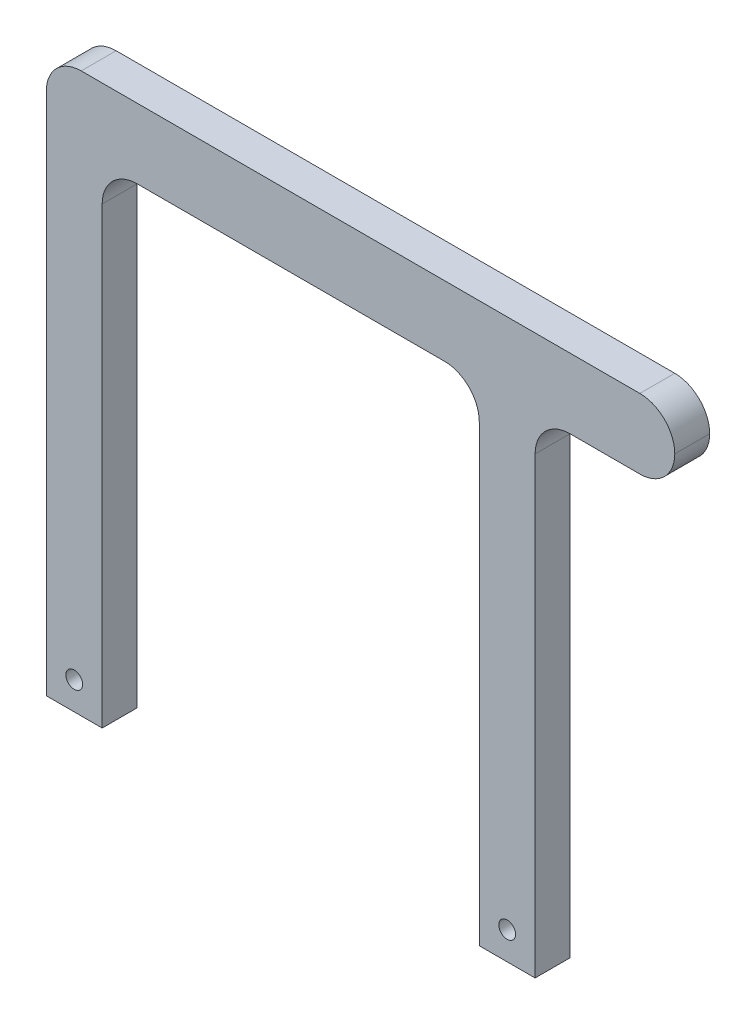
ISO-10303-21;
HEADER;
FILE_DESCRIPTION(('STEP AP214'),'2;1');
FILE_NAME('part.step','',(''),(''),'','','');
FILE_SCHEMA(('AUTOMOTIVE_DESIGN { 1 0 10303 214 1 1 1 1 }'));
ENDSEC;
DATA;
#1=APPLICATION_CONTEXT('core data for automotive mechanical design processes');
#2=APPLICATION_PROTOCOL_DEFINITION('international standard','automotive_design',2000,#1);
#3=PRODUCT_CONTEXT('',#1,'mechanical');
#4=PRODUCT('Part','Part','',(#3));
#5=PRODUCT_RELATED_PRODUCT_CATEGORY('part','',(#4));
#6=PRODUCT_DEFINITION_FORMATION('','',#4);
#7=PRODUCT_DEFINITION_CONTEXT('part definition',#1,'design');
#8=PRODUCT_DEFINITION('design','',#6,#7);
#9=PRODUCT_DEFINITION_SHAPE('','',#8);
#10=(LENGTH_UNIT() NAMED_UNIT(*) SI_UNIT(.MILLI.,.METRE.));
#11=(NAMED_UNIT(*) PLANE_ANGLE_UNIT() SI_UNIT($,.RADIAN.));
#12=(NAMED_UNIT(*) SI_UNIT($,.STERADIAN.) SOLID_ANGLE_UNIT());
#13=UNCERTAINTY_MEASURE_WITH_UNIT(LENGTH_MEASURE(1.E-05),#10,'distance_accuracy_value','');
#14=(GEOMETRIC_REPRESENTATION_CONTEXT(3) GLOBAL_UNCERTAINTY_ASSIGNED_CONTEXT((#13)) GLOBAL_UNIT_ASSIGNED_CONTEXT((#10,
#11,#12)) REPRESENTATION_CONTEXT('',''));
#15=CARTESIAN_POINT('',(0.,0.,0.));
#16=DIRECTION('',(0.,0.,1.));
#17=DIRECTION('',(1.,0.,0.));
#18=AXIS2_PLACEMENT_3D('',#15,#16,#17);
#19=CARTESIAN_POINT('',(0.,0.,0.));
#20=DIRECTION('',(0.,0.,-1.));
#21=DIRECTION('',(-1.,0.,0.));
#22=AXIS2_PLACEMENT_3D('',#19,#20,#21);
#23=PLANE('',#22);
#24=CARTESIAN_POINT('',(66.,4.,0.));
#25=DIRECTION('',(0.,0.,-1.));
#26=DIRECTION('',(-1.,0.,0.));
#27=AXIS2_PLACEMENT_3D('',#24,#25,#26);
#28=CIRCLE('',#27,1.2);
#29=CARTESIAN_POINT('',(64.8,4.,0.));
#30=VERTEX_POINT('',#29);
#31=EDGE_CURVE('E289',#30,#30,#28,.F.);
#32=ORIENTED_EDGE('',*,*,#31,.T.);
#33=EDGE_LOOP('',(#32));
#34=FACE_BOUND('',#33,.T.);
#35=DIRECTION('',(0.,-1.,0.));
#36=VECTOR('',#35,1.);
#37=CARTESIAN_POINT('',(0.,0.,0.));
#38=LINE('',#37,#36);
#39=CARTESIAN_POINT('',(0.,75.,0.));
#40=VERTEX_POINT('',#39);
#41=CARTESIAN_POINT('',(0.,0.,0.));
#42=VERTEX_POINT('',#41);
#43=EDGE_CURVE('E172',#40,#42,#38,.T.);
#44=ORIENTED_EDGE('',*,*,#43,.F.);
#45=CARTESIAN_POINT('',(5.,75.,0.));
#46=DIRECTION('',(0.,0.,-1.));
#47=DIRECTION('',(-1.,0.,0.));
#48=AXIS2_PLACEMENT_3D('',#45,#46,#47);
#49=CIRCLE('',#48,5.);
#50=CARTESIAN_POINT('',(5.,80.,0.));
#51=VERTEX_POINT('',#50);
#52=EDGE_CURVE('E196',#40,#51,#49,.T.);
#53=ORIENTED_EDGE('',*,*,#52,.T.);
#54=DIRECTION('',(-1.,0.,0.));
#55=VECTOR('',#54,1.);
#56=CARTESIAN_POINT('',(0.,80.,0.));
#57=LINE('',#56,#55);
#58=CARTESIAN_POINT('',(85.,80.,0.));
#59=VERTEX_POINT('',#58);
#60=EDGE_CURVE('E306',#59,#51,#57,.T.);
#61=ORIENTED_EDGE('',*,*,#60,.F.);
#62=CARTESIAN_POINT('',(85.,75.,0.));
#63=DIRECTION('',(0.,0.,-1.));
#64=DIRECTION('',(-1.,0.,0.));
#65=AXIS2_PLACEMENT_3D('',#62,#63,#64);
#66=CIRCLE('',#65,5.);
#67=CARTESIAN_POINT('',(90.,75.,0.));
#68=VERTEX_POINT('',#67);
#69=EDGE_CURVE('E193',#59,#68,#66,.T.);
#70=ORIENTED_EDGE('',*,*,#69,.T.);
#71=CARTESIAN_POINT('',(85.,75.,0.));
#72=DIRECTION('',(0.,0.,-1.));
#73=DIRECTION('',(-1.,0.,0.));
#74=AXIS2_PLACEMENT_3D('',#71,#72,#73);
#75=CIRCLE('',#74,5.);
#76=CARTESIAN_POINT('',(85.,70.,0.));
#77=VERTEX_POINT('',#76);
#78=EDGE_CURVE('E184',#68,#77,#75,.T.);
#79=ORIENTED_EDGE('',*,*,#78,.T.);
#80=DIRECTION('',(1.,0.,0.));
#81=VECTOR('',#80,1.);
#82=CARTESIAN_POINT('',(90.,70.,0.));
#83=LINE('',#82,#81);
#84=CARTESIAN_POINT('',(75.,70.,0.));
#85=VERTEX_POINT('',#84);
#86=EDGE_CURVE('E303',#85,#77,#83,.T.);
#87=ORIENTED_EDGE('',*,*,#86,.F.);
#88=CARTESIAN_POINT('',(75.,65.,0.));
#89=DIRECTION('',(0.,0.,-1.));
#90=DIRECTION('',(-1.,0.,0.));
#91=AXIS2_PLACEMENT_3D('',#88,#89,#90);
#92=CIRCLE('',#91,5.);
#93=CARTESIAN_POINT('',(70.,65.,0.));
#94=VERTEX_POINT('',#93);
#95=EDGE_CURVE('E236',#85,#94,#92,.F.);
#96=ORIENTED_EDGE('',*,*,#95,.T.);
#97=DIRECTION('',(0.,1.,0.));
#98=VECTOR('',#97,1.);
#99=CARTESIAN_POINT('',(70.,70.,0.));
#100=LINE('',#99,#98);
#101=CARTESIAN_POINT('',(70.,0.,0.));
#102=VERTEX_POINT('',#101);
#103=EDGE_CURVE('E299',#102,#94,#100,.T.);
#104=ORIENTED_EDGE('',*,*,#103,.F.);
#105=DIRECTION('',(1.,0.,0.));
#106=VECTOR('',#105,1.);
#107=CARTESIAN_POINT('',(70.,0.,0.));
#108=LINE('',#107,#106);
#109=CARTESIAN_POINT('',(62.,0.,0.));
#110=VERTEX_POINT('',#109);
#111=EDGE_CURVE('E296',#110,#102,#108,.T.);
#112=ORIENTED_EDGE('',*,*,#111,.F.);
#113=DIRECTION('',(0.,-1.,0.));
#114=VECTOR('',#113,1.);
#115=CARTESIAN_POINT('',(62.,0.,0.));
#116=LINE('',#115,#114);
#117=CARTESIAN_POINT('',(62.,65.,0.));
#118=VERTEX_POINT('',#117);
#119=EDGE_CURVE('E293',#118,#110,#116,.T.);
#120=ORIENTED_EDGE('',*,*,#119,.F.);
#121=CARTESIAN_POINT('',(57.,65.,0.));
#122=DIRECTION('',(0.,0.,-1.));
#123=DIRECTION('',(-1.,0.,0.));
#124=AXIS2_PLACEMENT_3D('',#121,#122,#123);
#125=CIRCLE('',#124,5.);
#126=CARTESIAN_POINT('',(57.,70.,0.));
#127=VERTEX_POINT('',#126);
#128=EDGE_CURVE('E242',#118,#127,#125,.F.);
#129=ORIENTED_EDGE('',*,*,#128,.T.);
#130=DIRECTION('',(1.,0.,0.));
#131=VECTOR('',#130,1.);
#132=CARTESIAN_POINT('',(62.,70.,0.));
#133=LINE('',#132,#131);
#134=CARTESIAN_POINT('',(13.,70.,0.));
#135=VERTEX_POINT('',#134);
#136=EDGE_CURVE('E255',#135,#127,#133,.T.);
#137=ORIENTED_EDGE('',*,*,#136,.F.);
#138=CARTESIAN_POINT('',(13.,65.,0.));
#139=DIRECTION('',(0.,0.,-1.));
#140=DIRECTION('',(-1.,0.,0.));
#141=AXIS2_PLACEMENT_3D('',#138,#139,#140);
#142=CIRCLE('',#141,5.);
#143=CARTESIAN_POINT('',(7.99999999999999,65.,0.));
#144=VERTEX_POINT('',#143);
#145=EDGE_CURVE('E49',#135,#144,#142,.F.);
#146=ORIENTED_EDGE('',*,*,#145,.T.);
#147=DIRECTION('',(0.,1.,0.));
#148=VECTOR('',#147,1.);
#149=CARTESIAN_POINT('',(7.99999999999999,70.,0.));
#150=LINE('',#149,#148);
#151=CARTESIAN_POINT('',(8.,0.,0.));
#152=VERTEX_POINT('',#151);
#153=EDGE_CURVE('E253',#152,#144,#150,.T.);
#154=ORIENTED_EDGE('',*,*,#153,.F.);
#155=DIRECTION('',(1.,0.,0.));
#156=VECTOR('',#155,1.);
#157=CARTESIAN_POINT('',(8.,0.,0.));
#158=LINE('',#157,#156);
#159=EDGE_CURVE('E176',#42,#152,#158,.T.);
#160=ORIENTED_EDGE('',*,*,#159,.F.);
#161=EDGE_LOOP('',(#44,#53,#61,#70,#79,#87,#96,#104,#112,#120,#129,#137,#146,#154,#160));
#162=FACE_BOUND('',#161,.T.);
#163=CARTESIAN_POINT('',(4.,4.,0.));
#164=DIRECTION('',(0.,0.,-1.));
#165=DIRECTION('',(-1.,0.,0.));
#166=AXIS2_PLACEMENT_3D('',#163,#164,#165);
#167=CIRCLE('',#166,1.2);
#168=CARTESIAN_POINT('',(2.8,4.,0.));
#169=VERTEX_POINT('',#168);
#170=EDGE_CURVE('E382',#169,#169,#167,.F.);
#171=ORIENTED_EDGE('',*,*,#170,.T.);
#172=EDGE_LOOP('',(#171));
#173=FACE_BOUND('',#172,.T.);
#174=ADVANCED_FACE('F39',(#34,#162,#173),#23,.T.);
#175=CARTESIAN_POINT('',(0.,0.,5.));
#176=DIRECTION('',(0.,0.,-1.));
#177=DIRECTION('',(-1.,0.,0.));
#178=AXIS2_PLACEMENT_3D('',#175,#176,#177);
#179=PLANE('',#178);
#180=CARTESIAN_POINT('',(4.,4.,5.));
#181=DIRECTION('',(0.,0.,1.));
#182=DIRECTION('',(1.,0.,0.));
#183=AXIS2_PLACEMENT_3D('',#180,#181,#182);
#184=CIRCLE('',#183,1.2);
#185=CARTESIAN_POINT('',(5.2,4.,5.));
#186=VERTEX_POINT('',#185);
#187=EDGE_CURVE('E338',#186,#186,#184,.T.);
#188=ORIENTED_EDGE('',*,*,#187,.F.);
#189=EDGE_LOOP('',(#188));
#190=FACE_BOUND('',#189,.T.);
#191=CARTESIAN_POINT('',(66.,4.,5.));
#192=DIRECTION('',(0.,0.,1.));
#193=DIRECTION('',(1.,0.,0.));
#194=AXIS2_PLACEMENT_3D('',#191,#192,#193);
#195=CIRCLE('',#194,1.20000000000001);
#196=CARTESIAN_POINT('',(67.2,4.,5.));
#197=VERTEX_POINT('',#196);
#198=EDGE_CURVE('E388',#197,#197,#195,.T.);
#199=ORIENTED_EDGE('',*,*,#198,.F.);
#200=EDGE_LOOP('',(#199));
#201=FACE_BOUND('',#200,.T.);
#202=DIRECTION('',(-1.,0.,0.));
#203=VECTOR('',#202,1.);
#204=CARTESIAN_POINT('',(0.,80.,5.));
#205=LINE('',#204,#203);
#206=CARTESIAN_POINT('',(85.,80.,5.));
#207=VERTEX_POINT('',#206);
#208=CARTESIAN_POINT('',(5.,80.,5.));
#209=VERTEX_POINT('',#208);
#210=EDGE_CURVE('E282',#207,#209,#205,.T.);
#211=ORIENTED_EDGE('',*,*,#210,.T.);
#212=CARTESIAN_POINT('',(5.,75.,5.));
#213=DIRECTION('',(0.,0.,-1.));
#214=DIRECTION('',(-1.,0.,0.));
#215=AXIS2_PLACEMENT_3D('',#212,#213,#214);
#216=CIRCLE('',#215,5.);
#217=CARTESIAN_POINT('',(0.,75.,5.));
#218=VERTEX_POINT('',#217);
#219=EDGE_CURVE('E211',#209,#218,#216,.F.);
#220=ORIENTED_EDGE('',*,*,#219,.T.);
#221=DIRECTION('',(0.,-1.,0.));
#222=VECTOR('',#221,1.);
#223=CARTESIAN_POINT('',(0.,0.,5.));
#224=LINE('',#223,#222);
#225=CARTESIAN_POINT('',(0.,0.,5.));
#226=VERTEX_POINT('',#225);
#227=EDGE_CURVE('E167',#218,#226,#224,.T.);
#228=ORIENTED_EDGE('',*,*,#227,.T.);
#229=DIRECTION('',(1.,0.,0.));
#230=VECTOR('',#229,1.);
#231=CARTESIAN_POINT('',(8.,0.,5.));
#232=LINE('',#231,#230);
#233=CARTESIAN_POINT('',(8.,0.,5.));
#234=VERTEX_POINT('',#233);
#235=EDGE_CURVE('E161',#226,#234,#232,.T.);
#236=ORIENTED_EDGE('',*,*,#235,.T.);
#237=DIRECTION('',(0.,1.,0.));
#238=VECTOR('',#237,1.);
#239=CARTESIAN_POINT('',(7.99999999999999,70.,5.));
#240=LINE('',#239,#238);
#241=CARTESIAN_POINT('',(7.99999999999999,65.,5.));
#242=VERTEX_POINT('',#241);
#243=EDGE_CURVE('E149',#234,#242,#240,.T.);
#244=ORIENTED_EDGE('',*,*,#243,.T.);
#245=CARTESIAN_POINT('',(13.,65.,5.));
#246=DIRECTION('',(0.,0.,-1.));
#247=DIRECTION('',(-1.,0.,0.));
#248=AXIS2_PLACEMENT_3D('',#245,#246,#247);
#249=CIRCLE('',#248,5.);
#250=CARTESIAN_POINT('',(13.,70.,5.));
#251=VERTEX_POINT('',#250);
#252=EDGE_CURVE('E11',#242,#251,#249,.T.);
#253=ORIENTED_EDGE('',*,*,#252,.T.);
#254=DIRECTION('',(1.,0.,0.));
#255=VECTOR('',#254,1.);
#256=CARTESIAN_POINT('',(62.,70.,5.));
#257=LINE('',#256,#255);
#258=CARTESIAN_POINT('',(57.,70.,5.));
#259=VERTEX_POINT('',#258);
#260=EDGE_CURVE('E160',#251,#259,#257,.T.);
#261=ORIENTED_EDGE('',*,*,#260,.T.);
#262=CARTESIAN_POINT('',(57.,65.,5.));
#263=DIRECTION('',(0.,0.,-1.));
#264=DIRECTION('',(-1.,0.,0.));
#265=AXIS2_PLACEMENT_3D('',#262,#263,#264);
#266=CIRCLE('',#265,5.);
#267=CARTESIAN_POINT('',(62.,65.,5.));
#268=VERTEX_POINT('',#267);
#269=EDGE_CURVE('E245',#259,#268,#266,.T.);
#270=ORIENTED_EDGE('',*,*,#269,.T.);
#271=DIRECTION('',(0.,-1.,0.));
#272=VECTOR('',#271,1.);
#273=CARTESIAN_POINT('',(62.,0.,5.));
#274=LINE('',#273,#272);
#275=CARTESIAN_POINT('',(62.,0.,5.));
#276=VERTEX_POINT('',#275);
#277=EDGE_CURVE('E267',#268,#276,#274,.T.);
#278=ORIENTED_EDGE('',*,*,#277,.T.);
#279=DIRECTION('',(1.,0.,0.));
#280=VECTOR('',#279,1.);
#281=CARTESIAN_POINT('',(70.,0.,5.));
#282=LINE('',#281,#280);
#283=CARTESIAN_POINT('',(70.,0.,5.));
#284=VERTEX_POINT('',#283);
#285=EDGE_CURVE('E270',#276,#284,#282,.T.);
#286=ORIENTED_EDGE('',*,*,#285,.T.);
#287=DIRECTION('',(0.,1.,0.));
#288=VECTOR('',#287,1.);
#289=CARTESIAN_POINT('',(70.,70.,5.));
#290=LINE('',#289,#288);
#291=CARTESIAN_POINT('',(70.,65.,5.));
#292=VERTEX_POINT('',#291);
#293=EDGE_CURVE('E275',#284,#292,#290,.T.);
#294=ORIENTED_EDGE('',*,*,#293,.T.);
#295=CARTESIAN_POINT('',(75.,65.,5.));
#296=DIRECTION('',(0.,0.,-1.));
#297=DIRECTION('',(-1.,0.,0.));
#298=AXIS2_PLACEMENT_3D('',#295,#296,#297);
#299=CIRCLE('',#298,5.);
#300=CARTESIAN_POINT('',(75.,70.,5.));
#301=VERTEX_POINT('',#300);
#302=EDGE_CURVE('E239',#292,#301,#299,.T.);
#303=ORIENTED_EDGE('',*,*,#302,.T.);
#304=DIRECTION('',(1.,0.,0.));
#305=VECTOR('',#304,1.);
#306=CARTESIAN_POINT('',(90.,70.,5.));
#307=LINE('',#306,#305);
#308=CARTESIAN_POINT('',(85.,70.,5.));
#309=VERTEX_POINT('',#308);
#310=EDGE_CURVE('E279',#301,#309,#307,.T.);
#311=ORIENTED_EDGE('',*,*,#310,.T.);
#312=CARTESIAN_POINT('',(85.,75.,5.));
#313=DIRECTION('',(0.,0.,-1.));
#314=DIRECTION('',(-1.,0.,0.));
#315=AXIS2_PLACEMENT_3D('',#312,#313,#314);
#316=CIRCLE('',#315,5.);
#317=CARTESIAN_POINT('',(90.,75.,5.));
#318=VERTEX_POINT('',#317);
#319=EDGE_CURVE('E56',#309,#318,#316,.F.);
#320=ORIENTED_EDGE('',*,*,#319,.T.);
#321=CARTESIAN_POINT('',(85.,75.,5.));
#322=DIRECTION('',(0.,0.,-1.));
#323=DIRECTION('',(-1.,0.,0.));
#324=AXIS2_PLACEMENT_3D('',#321,#322,#323);
#325=CIRCLE('',#324,5.);
#326=EDGE_CURVE('E208',#318,#207,#325,.F.);
#327=ORIENTED_EDGE('',*,*,#326,.T.);
#328=EDGE_LOOP('',(#211,#220,#228,#236,#244,#253,#261,#270,#278,#286,#294,#303,#311,#320,#327));
#329=FACE_BOUND('',#328,.T.);
#330=ADVANCED_FACE('F165',(#190,#201,#329),#179,.F.);
#331=CARTESIAN_POINT('',(8.,0.,5.));
#332=DIRECTION('',(0.,1.,0.));
#333=DIRECTION('',(0.,0.,1.));
#334=AXIS2_PLACEMENT_3D('',#331,#332,#333);
#335=PLANE('',#334);
#336=ORIENTED_EDGE('',*,*,#159,.T.);
#337=DIRECTION('',(0.,0.,-1.));
#338=VECTOR('',#337,1.);
#339=CARTESIAN_POINT('',(8.,0.,5.));
#340=LINE('',#339,#338);
#341=EDGE_CURVE('E154',#234,#152,#340,.T.);
#342=ORIENTED_EDGE('',*,*,#341,.F.);
#343=ORIENTED_EDGE('',*,*,#235,.F.);
#344=DIRECTION('',(0.,0.,-1.));
#345=VECTOR('',#344,1.);
#346=CARTESIAN_POINT('',(0.,0.,5.));
#347=LINE('',#346,#345);
#348=EDGE_CURVE('E287',#226,#42,#347,.T.);
#349=ORIENTED_EDGE('',*,*,#348,.T.);
#350=EDGE_LOOP('',(#336,#342,#343,#349));
#351=FACE_BOUND('',#350,.T.);
#352=ADVANCED_FACE('F174',(#351),#335,.F.);
#353=CARTESIAN_POINT('',(7.99999999999999,70.,5.));
#354=DIRECTION('',(-1.,0.,0.));
#355=DIRECTION('',(0.,-1.,0.));
#356=AXIS2_PLACEMENT_3D('',#353,#354,#355);
#357=PLANE('',#356);
#358=ORIENTED_EDGE('',*,*,#153,.T.);
#359=DIRECTION('',(0.,0.,-1.));
#360=VECTOR('',#359,1.);
#361=CARTESIAN_POINT('',(7.99999999999999,65.,5.));
#362=LINE('',#361,#360);
#363=EDGE_CURVE('E157',#144,#242,#362,.F.);
#364=ORIENTED_EDGE('',*,*,#363,.T.);
#365=ORIENTED_EDGE('',*,*,#243,.F.);
#366=ORIENTED_EDGE('',*,*,#341,.T.);
#367=EDGE_LOOP('',(#358,#364,#365,#366));
#368=FACE_BOUND('',#367,.T.);
#369=ADVANCED_FACE('F152',(#368),#357,.F.);
#370=CARTESIAN_POINT('',(62.,70.,5.));
#371=DIRECTION('',(0.,1.,0.));
#372=DIRECTION('',(0.,0.,1.));
#373=AXIS2_PLACEMENT_3D('',#370,#371,#372);
#374=PLANE('',#373);
#375=ORIENTED_EDGE('',*,*,#136,.T.);
#376=DIRECTION('',(0.,0.,-1.));
#377=VECTOR('',#376,1.);
#378=CARTESIAN_POINT('',(57.,70.,5.));
#379=LINE('',#378,#377);
#380=EDGE_CURVE('E231',#127,#259,#379,.F.);
#381=ORIENTED_EDGE('',*,*,#380,.T.);
#382=ORIENTED_EDGE('',*,*,#260,.F.);
#383=DIRECTION('',(0.,0.,-1.));
#384=VECTOR('',#383,1.);
#385=CARTESIAN_POINT('',(13.,70.,0.));
#386=LINE('',#385,#384);
#387=EDGE_CURVE('E227',#251,#135,#386,.T.);
#388=ORIENTED_EDGE('',*,*,#387,.T.);
#389=EDGE_LOOP('',(#375,#381,#382,#388));
#390=FACE_BOUND('',#389,.T.);
#391=ADVANCED_FACE('F264',(#390),#374,.F.);
#392=CARTESIAN_POINT('',(62.,0.,5.));
#393=DIRECTION('',(1.,0.,0.));
#394=DIRECTION('',(0.,0.,-1.));
#395=AXIS2_PLACEMENT_3D('',#392,#393,#394);
#396=PLANE('',#395);
#397=ORIENTED_EDGE('',*,*,#277,.F.);
#398=DIRECTION('',(0.,0.,-1.));
#399=VECTOR('',#398,1.);
#400=CARTESIAN_POINT('',(62.,65.,0.));
#401=LINE('',#400,#399);
#402=EDGE_CURVE('E223',#268,#118,#401,.T.);
#403=ORIENTED_EDGE('',*,*,#402,.T.);
#404=ORIENTED_EDGE('',*,*,#119,.T.);
#405=DIRECTION('',(0.,0.,-1.));
#406=VECTOR('',#405,1.);
#407=CARTESIAN_POINT('',(62.,0.,5.));
#408=LINE('',#407,#406);
#409=EDGE_CURVE('E179',#276,#110,#408,.T.);
#410=ORIENTED_EDGE('',*,*,#409,.F.);
#411=EDGE_LOOP('',(#397,#403,#404,#410));
#412=FACE_BOUND('',#411,.T.);
#413=ADVANCED_FACE('F419',(#412),#396,.F.);
#414=CARTESIAN_POINT('',(70.,0.,5.));
#415=DIRECTION('',(0.,1.,0.));
#416=DIRECTION('',(-1.,0.,0.));
#417=AXIS2_PLACEMENT_3D('',#414,#415,#416);
#418=PLANE('',#417);
#419=ORIENTED_EDGE('',*,*,#111,.T.);
#420=DIRECTION('',(0.,0.,-1.));
#421=VECTOR('',#420,1.);
#422=CARTESIAN_POINT('',(70.,0.,5.));
#423=LINE('',#422,#421);
#424=EDGE_CURVE('E187',#284,#102,#423,.T.);
#425=ORIENTED_EDGE('',*,*,#424,.F.);
#426=ORIENTED_EDGE('',*,*,#285,.F.);
#427=ORIENTED_EDGE('',*,*,#409,.T.);
#428=EDGE_LOOP('',(#419,#425,#426,#427));
#429=FACE_BOUND('',#428,.T.);
#430=ADVANCED_FACE('F420',(#429),#418,.F.);
#431=CARTESIAN_POINT('',(70.,70.,5.));
#432=DIRECTION('',(-1.,0.,0.));
#433=DIRECTION('',(0.,-1.,0.));
#434=AXIS2_PLACEMENT_3D('',#431,#432,#433);
#435=PLANE('',#434);
#436=ORIENTED_EDGE('',*,*,#103,.T.);
#437=DIRECTION('',(0.,0.,-1.));
#438=VECTOR('',#437,1.);
#439=CARTESIAN_POINT('',(70.,65.,5.));
#440=LINE('',#439,#438);
#441=EDGE_CURVE('E220',#94,#292,#440,.F.);
#442=ORIENTED_EDGE('',*,*,#441,.T.);
#443=ORIENTED_EDGE('',*,*,#293,.F.);
#444=ORIENTED_EDGE('',*,*,#424,.T.);
#445=EDGE_LOOP('',(#436,#442,#443,#444));
#446=FACE_BOUND('',#445,.T.);
#447=ADVANCED_FACE('F319',(#446),#435,.F.);
#448=CARTESIAN_POINT('',(90.,70.,5.));
#449=DIRECTION('',(0.,1.,0.));
#450=DIRECTION('',(0.,0.,1.));
#451=AXIS2_PLACEMENT_3D('',#448,#449,#450);
#452=PLANE('',#451);
#453=ORIENTED_EDGE('',*,*,#86,.T.);
#454=DIRECTION('',(0.,0.,-1.));
#455=VECTOR('',#454,1.);
#456=CARTESIAN_POINT('',(85.,70.,5.));
#457=LINE('',#456,#455);
#458=EDGE_CURVE('E64',#77,#309,#457,.F.);
#459=ORIENTED_EDGE('',*,*,#458,.T.);
#460=ORIENTED_EDGE('',*,*,#310,.F.);
#461=DIRECTION('',(0.,0.,-1.));
#462=VECTOR('',#461,1.);
#463=CARTESIAN_POINT('',(75.,70.,0.));
#464=LINE('',#463,#462);
#465=EDGE_CURVE('E214',#301,#85,#464,.T.);
#466=ORIENTED_EDGE('',*,*,#465,.T.);
#467=EDGE_LOOP('',(#453,#459,#460,#466));
#468=FACE_BOUND('',#467,.T.);
#469=ADVANCED_FACE('F330',(#468),#452,.F.);
#470=CARTESIAN_POINT('',(0.,80.,5.));
#471=DIRECTION('',(0.,-1.,0.));
#472=DIRECTION('',(0.,0.,-1.));
#473=AXIS2_PLACEMENT_3D('',#470,#471,#472);
#474=PLANE('',#473);
#475=ORIENTED_EDGE('',*,*,#60,.T.);
#476=DIRECTION('',(0.,0.,-1.));
#477=VECTOR('',#476,1.);
#478=CARTESIAN_POINT('',(5.,80.,5.));
#479=LINE('',#478,#477);
#480=EDGE_CURVE('E203',#51,#209,#479,.F.);
#481=ORIENTED_EDGE('',*,*,#480,.T.);
#482=ORIENTED_EDGE('',*,*,#210,.F.);
#483=DIRECTION('',(0.,0.,-1.));
#484=VECTOR('',#483,1.);
#485=CARTESIAN_POINT('',(85.,80.,5.));
#486=LINE('',#485,#484);
#487=EDGE_CURVE('E199',#207,#59,#486,.T.);
#488=ORIENTED_EDGE('',*,*,#487,.T.);
#489=EDGE_LOOP('',(#475,#481,#482,#488));
#490=FACE_BOUND('',#489,.T.);
#491=ADVANCED_FACE('F344',(#490),#474,.F.);
#492=CARTESIAN_POINT('',(0.,0.,5.));
#493=DIRECTION('',(1.,0.,0.));
#494=DIRECTION('',(0.,0.,-1.));
#495=AXIS2_PLACEMENT_3D('',#492,#493,#494);
#496=PLANE('',#495);
#497=ORIENTED_EDGE('',*,*,#227,.F.);
#498=DIRECTION('',(0.,0.,-1.));
#499=VECTOR('',#498,1.);
#500=CARTESIAN_POINT('',(0.,75.,5.));
#501=LINE('',#500,#499);
#502=EDGE_CURVE('E178',#218,#40,#501,.T.);
#503=ORIENTED_EDGE('',*,*,#502,.T.);
#504=ORIENTED_EDGE('',*,*,#43,.T.);
#505=ORIENTED_EDGE('',*,*,#348,.F.);
#506=EDGE_LOOP('',(#497,#503,#504,#505));
#507=FACE_BOUND('',#506,.T.);
#508=ADVANCED_FACE('F351',(#507),#496,.F.);
#509=CARTESIAN_POINT('',(66.,4.,5.));
#510=DIRECTION('',(0.,0.,1.));
#511=DIRECTION('',(1.,0.,0.));
#512=AXIS2_PLACEMENT_3D('',#509,#510,#511);
#513=CYLINDRICAL_SURFACE('',#512,1.2);
#514=ORIENTED_EDGE('',*,*,#31,.F.);
#515=EDGE_LOOP('',(#514));
#516=FACE_BOUND('',#515,.T.);
#517=ORIENTED_EDGE('',*,*,#198,.T.);
#518=EDGE_LOOP('',(#517));
#519=FACE_BOUND('',#518,.T.);
#520=ADVANCED_FACE('F353',(#516,#519),#513,.F.);
#521=CARTESIAN_POINT('',(4.,4.,5.));
#522=DIRECTION('',(0.,0.,1.));
#523=DIRECTION('',(1.,0.,0.));
#524=AXIS2_PLACEMENT_3D('',#521,#522,#523);
#525=CYLINDRICAL_SURFACE('',#524,1.2);
#526=ORIENTED_EDGE('',*,*,#170,.F.);
#527=EDGE_LOOP('',(#526));
#528=FACE_BOUND('',#527,.T.);
#529=ORIENTED_EDGE('',*,*,#187,.T.);
#530=EDGE_LOOP('',(#529));
#531=FACE_BOUND('',#530,.T.);
#532=ADVANCED_FACE('F359',(#528,#531),#525,.F.);
#533=CARTESIAN_POINT('',(5.,75.,5.));
#534=DIRECTION('',(0.,0.,-1.));
#535=DIRECTION('',(-1.,0.,0.));
#536=AXIS2_PLACEMENT_3D('',#533,#534,#535);
#537=CYLINDRICAL_SURFACE('',#536,5.);
#538=ORIENTED_EDGE('',*,*,#219,.F.);
#539=ORIENTED_EDGE('',*,*,#480,.F.);
#540=ORIENTED_EDGE('',*,*,#52,.F.);
#541=ORIENTED_EDGE('',*,*,#502,.F.);
#542=EDGE_LOOP('',(#538,#539,#540,#541));
#543=FACE_BOUND('',#542,.T.);
#544=ADVANCED_FACE('F348',(#543),#537,.T.);
#545=CARTESIAN_POINT('',(85.,75.,5.));
#546=DIRECTION('',(0.,0.,-1.));
#547=DIRECTION('',(-1.,0.,0.));
#548=AXIS2_PLACEMENT_3D('',#545,#546,#547);
#549=CYLINDRICAL_SURFACE('',#548,5.);
#550=DIRECTION('',(0.,0.,-1.));
#551=VECTOR('',#550,1.);
#552=CARTESIAN_POINT('',(90.,75.,5.));
#553=LINE('',#552,#551);
#554=EDGE_CURVE('E43',#318,#68,#553,.T.);
#555=ORIENTED_EDGE('',*,*,#554,.F.);
#556=ORIENTED_EDGE('',*,*,#319,.F.);
#557=ORIENTED_EDGE('',*,*,#458,.F.);
#558=ORIENTED_EDGE('',*,*,#78,.F.);
#559=EDGE_LOOP('',(#555,#556,#557,#558));
#560=FACE_BOUND('',#559,.T.);
#561=ADVANCED_FACE('F332',(#560),#549,.T.);
#562=CARTESIAN_POINT('',(85.,75.,5.));
#563=DIRECTION('',(0.,0.,-1.));
#564=DIRECTION('',(-1.,0.,0.));
#565=AXIS2_PLACEMENT_3D('',#562,#563,#564);
#566=CYLINDRICAL_SURFACE('',#565,5.);
#567=ORIENTED_EDGE('',*,*,#326,.F.);
#568=ORIENTED_EDGE('',*,*,#554,.T.);
#569=ORIENTED_EDGE('',*,*,#69,.F.);
#570=ORIENTED_EDGE('',*,*,#487,.F.);
#571=EDGE_LOOP('',(#567,#568,#569,#570));
#572=FACE_BOUND('',#571,.T.);
#573=ADVANCED_FACE('F340',(#572),#566,.T.);
#574=CARTESIAN_POINT('',(75.,65.,5.));
#575=DIRECTION('',(0.,0.,1.));
#576=DIRECTION('',(1.,0.,0.));
#577=AXIS2_PLACEMENT_3D('',#574,#575,#576);
#578=CYLINDRICAL_SURFACE('',#577,5.);
#579=ORIENTED_EDGE('',*,*,#302,.F.);
#580=ORIENTED_EDGE('',*,*,#441,.F.);
#581=ORIENTED_EDGE('',*,*,#95,.F.);
#582=ORIENTED_EDGE('',*,*,#465,.F.);
#583=EDGE_LOOP('',(#579,#580,#581,#582));
#584=FACE_BOUND('',#583,.T.);
#585=ADVANCED_FACE('F329',(#584),#578,.F.);
#586=CARTESIAN_POINT('',(57.,65.,5.));
#587=DIRECTION('',(0.,0.,1.));
#588=DIRECTION('',(1.,0.,0.));
#589=AXIS2_PLACEMENT_3D('',#586,#587,#588);
#590=CYLINDRICAL_SURFACE('',#589,5.);
#591=ORIENTED_EDGE('',*,*,#269,.F.);
#592=ORIENTED_EDGE('',*,*,#380,.F.);
#593=ORIENTED_EDGE('',*,*,#128,.F.);
#594=ORIENTED_EDGE('',*,*,#402,.F.);
#595=EDGE_LOOP('',(#591,#592,#593,#594));
#596=FACE_BOUND('',#595,.T.);
#597=ADVANCED_FACE('F409',(#596),#590,.F.);
#598=CARTESIAN_POINT('',(13.,65.,5.));
#599=DIRECTION('',(0.,0.,1.));
#600=DIRECTION('',(1.,0.,0.));
#601=AXIS2_PLACEMENT_3D('',#598,#599,#600);
#602=CYLINDRICAL_SURFACE('',#601,5.);
#603=ORIENTED_EDGE('',*,*,#252,.F.);
#604=ORIENTED_EDGE('',*,*,#363,.F.);
#605=ORIENTED_EDGE('',*,*,#145,.F.);
#606=ORIENTED_EDGE('',*,*,#387,.F.);
#607=EDGE_LOOP('',(#603,#604,#605,#606));
#608=FACE_BOUND('',#607,.T.);
#609=ADVANCED_FACE('F41',(#608),#602,.F.);
#610=CLOSED_SHELL('',(#174,#330,#352,#369,#391,#413,#430,#447,#469,#491,#508,#520,#532,#544,
#561,#573,#585,#597,#609));
#611=MANIFOLD_SOLID_BREP('B2',#610);
#612=ADVANCED_BREP_SHAPE_REPRESENTATION('',(#18,#611),#14);
#613=SHAPE_DEFINITION_REPRESENTATION(#9,#612);
ENDSEC;
END-ISO-10303-21;
